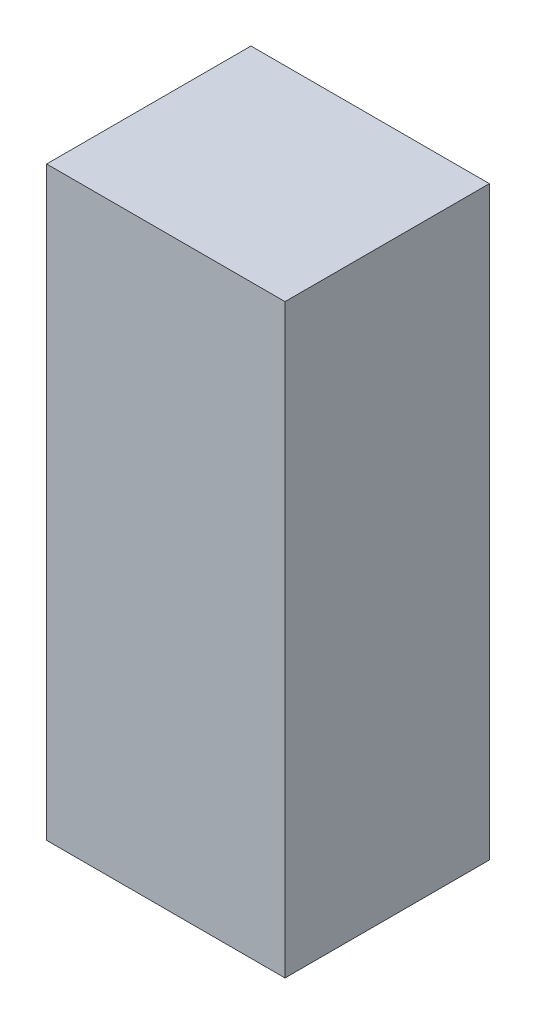
ISO-10303-21;
HEADER;
FILE_DESCRIPTION(('STEP AP214'),'2;1');
FILE_NAME('part.step','',(''),(''),'','','');
FILE_SCHEMA(('AUTOMOTIVE_DESIGN { 1 0 10303 214 1 1 1 1 }'));
ENDSEC;
DATA;
#1=APPLICATION_CONTEXT('core data for automotive mechanical design processes');
#2=APPLICATION_PROTOCOL_DEFINITION('international standard','automotive_design',2000,#1);
#3=PRODUCT_CONTEXT('',#1,'mechanical');
#4=PRODUCT('Part','Part','',(#3));
#5=PRODUCT_RELATED_PRODUCT_CATEGORY('part','',(#4));
#6=PRODUCT_DEFINITION_FORMATION('','',#4);
#7=PRODUCT_DEFINITION_CONTEXT('part definition',#1,'design');
#8=PRODUCT_DEFINITION('design','',#6,#7);
#9=PRODUCT_DEFINITION_SHAPE('','',#8);
#10=(LENGTH_UNIT() NAMED_UNIT(*) SI_UNIT(.MILLI.,.METRE.));
#11=(NAMED_UNIT(*) PLANE_ANGLE_UNIT() SI_UNIT($,.RADIAN.));
#12=(NAMED_UNIT(*) SI_UNIT($,.STERADIAN.) SOLID_ANGLE_UNIT());
#13=UNCERTAINTY_MEASURE_WITH_UNIT(LENGTH_MEASURE(1.E-05),#10,'distance_accuracy_value','');
#14=(GEOMETRIC_REPRESENTATION_CONTEXT(3) GLOBAL_UNCERTAINTY_ASSIGNED_CONTEXT((#13)) GLOBAL_UNIT_ASSIGNED_CONTEXT((#10,
#11,#12)) REPRESENTATION_CONTEXT('',''));
#15=CARTESIAN_POINT('',(0.,0.,0.));
#16=DIRECTION('',(0.,0.,1.));
#17=DIRECTION('',(1.,0.,0.));
#18=AXIS2_PLACEMENT_3D('',#15,#16,#17);
#19=CARTESIAN_POINT('',(0.,-250.,0.));
#20=DIRECTION('',(-1.,0.,0.));
#21=DIRECTION('',(0.,0.,1.));
#22=AXIS2_PLACEMENT_3D('',#19,#20,#21);
#23=PLANE('',#22);
#24=DIRECTION('',(0.,1.,0.));
#25=VECTOR('',#24,1.);
#26=CARTESIAN_POINT('',(0.,-250.,300.));
#27=LINE('',#26,#25);
#28=CARTESIAN_POINT('',(0.,-250.,300.));
#29=VERTEX_POINT('',#28);
#30=CARTESIAN_POINT('',(0.,610.,300.));
#31=VERTEX_POINT('',#30);
#32=EDGE_CURVE('E42',#29,#31,#27,.T.);
#33=ORIENTED_EDGE('',*,*,#32,.T.);
#34=DIRECTION('',(0.,0.,1.));
#35=VECTOR('',#34,1.);
#36=CARTESIAN_POINT('',(0.,610.,0.));
#37=LINE('',#36,#35);
#38=CARTESIAN_POINT('',(0.,610.,0.));
#39=VERTEX_POINT('',#38);
#40=EDGE_CURVE('E79',#39,#31,#37,.T.);
#41=ORIENTED_EDGE('',*,*,#40,.F.);
#42=DIRECTION('',(0.,1.,0.));
#43=VECTOR('',#42,1.);
#44=CARTESIAN_POINT('',(0.,-250.,0.));
#45=LINE('',#44,#43);
#46=CARTESIAN_POINT('',(0.,-250.,0.));
#47=VERTEX_POINT('',#46);
#48=EDGE_CURVE('E11',#47,#39,#45,.T.);
#49=ORIENTED_EDGE('',*,*,#48,.F.);
#50=DIRECTION('',(0.,0.,1.));
#51=VECTOR('',#50,1.);
#52=CARTESIAN_POINT('',(0.,-250.,0.));
#53=LINE('',#52,#51);
#54=EDGE_CURVE('E80',#47,#29,#53,.T.);
#55=ORIENTED_EDGE('',*,*,#54,.T.);
#56=EDGE_LOOP('',(#33,#41,#49,#55));
#57=FACE_BOUND('',#56,.T.);
#58=ADVANCED_FACE('F39',(#57),#23,.T.);
#59=CARTESIAN_POINT('',(0.,-250.,0.));
#60=DIRECTION('',(0.,0.,-1.));
#61=DIRECTION('',(-1.,0.,0.));
#62=AXIS2_PLACEMENT_3D('',#59,#60,#61);
#63=PLANE('',#62);
#64=ORIENTED_EDGE('',*,*,#48,.T.);
#65=DIRECTION('',(-1.,0.,0.));
#66=VECTOR('',#65,1.);
#67=CARTESIAN_POINT('',(0.,610.,0.));
#68=LINE('',#67,#66);
#69=CARTESIAN_POINT('',(350.,610.,0.));
#70=VERTEX_POINT('',#69);
#71=EDGE_CURVE('E96',#70,#39,#68,.T.);
#72=ORIENTED_EDGE('',*,*,#71,.F.);
#73=DIRECTION('',(0.,1.,0.));
#74=VECTOR('',#73,1.);
#75=CARTESIAN_POINT('',(350.,-250.,0.));
#76=LINE('',#75,#74);
#77=CARTESIAN_POINT('',(350.,-250.,0.));
#78=VERTEX_POINT('',#77);
#79=EDGE_CURVE('E47',#78,#70,#76,.T.);
#80=ORIENTED_EDGE('',*,*,#79,.F.);
#81=DIRECTION('',(-1.,0.,0.));
#82=VECTOR('',#81,1.);
#83=CARTESIAN_POINT('',(0.,-250.,0.));
#84=LINE('',#83,#82);
#85=EDGE_CURVE('E85',#78,#47,#84,.T.);
#86=ORIENTED_EDGE('',*,*,#85,.T.);
#87=EDGE_LOOP('',(#64,#72,#80,#86));
#88=FACE_BOUND('',#87,.T.);
#89=ADVANCED_FACE('F111',(#88),#63,.T.);
#90=CARTESIAN_POINT('',(350.,-250.,0.));
#91=DIRECTION('',(1.,0.,0.));
#92=DIRECTION('',(0.,0.,-1.));
#93=AXIS2_PLACEMENT_3D('',#90,#91,#92);
#94=PLANE('',#93);
#95=ORIENTED_EDGE('',*,*,#79,.T.);
#96=DIRECTION('',(0.,0.,-1.));
#97=VECTOR('',#96,1.);
#98=CARTESIAN_POINT('',(350.,610.,0.));
#99=LINE('',#98,#97);
#100=CARTESIAN_POINT('',(350.,610.,300.));
#101=VERTEX_POINT('',#100);
#102=EDGE_CURVE('E92',#101,#70,#99,.T.);
#103=ORIENTED_EDGE('',*,*,#102,.F.);
#104=DIRECTION('',(0.,1.,0.));
#105=VECTOR('',#104,1.);
#106=CARTESIAN_POINT('',(350.,-250.,300.));
#107=LINE('',#106,#105);
#108=CARTESIAN_POINT('',(350.,-250.,300.));
#109=VERTEX_POINT('',#108);
#110=EDGE_CURVE('E84',#109,#101,#107,.T.);
#111=ORIENTED_EDGE('',*,*,#110,.F.);
#112=DIRECTION('',(0.,0.,-1.));
#113=VECTOR('',#112,1.);
#114=CARTESIAN_POINT('',(350.,-250.,0.));
#115=LINE('',#114,#113);
#116=EDGE_CURVE('E104',#109,#78,#115,.T.);
#117=ORIENTED_EDGE('',*,*,#116,.T.);
#118=EDGE_LOOP('',(#95,#103,#111,#117));
#119=FACE_BOUND('',#118,.T.);
#120=ADVANCED_FACE('F108',(#119),#94,.T.);
#121=CARTESIAN_POINT('',(0.,-250.,300.));
#122=DIRECTION('',(0.,0.,1.));
#123=DIRECTION('',(1.,0.,0.));
#124=AXIS2_PLACEMENT_3D('',#121,#122,#123);
#125=PLANE('',#124);
#126=ORIENTED_EDGE('',*,*,#110,.T.);
#127=DIRECTION('',(1.,0.,0.));
#128=VECTOR('',#127,1.);
#129=CARTESIAN_POINT('',(0.,610.,300.));
#130=LINE('',#129,#128);
#131=EDGE_CURVE('E87',#31,#101,#130,.T.);
#132=ORIENTED_EDGE('',*,*,#131,.F.);
#133=ORIENTED_EDGE('',*,*,#32,.F.);
#134=DIRECTION('',(1.,0.,0.));
#135=VECTOR('',#134,1.);
#136=CARTESIAN_POINT('',(0.,-250.,300.));
#137=LINE('',#136,#135);
#138=EDGE_CURVE('E102',#29,#109,#137,.T.);
#139=ORIENTED_EDGE('',*,*,#138,.T.);
#140=EDGE_LOOP('',(#126,#132,#133,#139));
#141=FACE_BOUND('',#140,.T.);
#142=ADVANCED_FACE('F88',(#141),#125,.T.);
#143=CARTESIAN_POINT('',(0.,-250.,0.));
#144=DIRECTION('',(0.,1.,0.));
#145=DIRECTION('',(0.,0.,1.));
#146=AXIS2_PLACEMENT_3D('',#143,#144,#145);
#147=PLANE('',#146);
#148=ORIENTED_EDGE('',*,*,#54,.F.);
#149=ORIENTED_EDGE('',*,*,#85,.F.);
#150=ORIENTED_EDGE('',*,*,#116,.F.);
#151=ORIENTED_EDGE('',*,*,#138,.F.);
#152=EDGE_LOOP('',(#148,#149,#150,#151));
#153=FACE_BOUND('',#152,.T.);
#154=ADVANCED_FACE('F113',(#153),#147,.F.);
#155=CARTESIAN_POINT('',(0.,610.,0.));
#156=DIRECTION('',(0.,1.,0.));
#157=DIRECTION('',(0.,0.,1.));
#158=AXIS2_PLACEMENT_3D('',#155,#156,#157);
#159=PLANE('',#158);
#160=ORIENTED_EDGE('',*,*,#40,.T.);
#161=ORIENTED_EDGE('',*,*,#131,.T.);
#162=ORIENTED_EDGE('',*,*,#102,.T.);
#163=ORIENTED_EDGE('',*,*,#71,.T.);
#164=EDGE_LOOP('',(#160,#161,#162,#163));
#165=FACE_BOUND('',#164,.T.);
#166=ADVANCED_FACE('F95',(#165),#159,.T.);
#167=CLOSED_SHELL('',(#58,#89,#120,#142,#154,#166));
#168=MANIFOLD_SOLID_BREP('B2',#167);
#169=ADVANCED_BREP_SHAPE_REPRESENTATION('',(#18,#168),#14);
#170=SHAPE_DEFINITION_REPRESENTATION(#9,#169);
ENDSEC;
END-ISO-10303-21;
